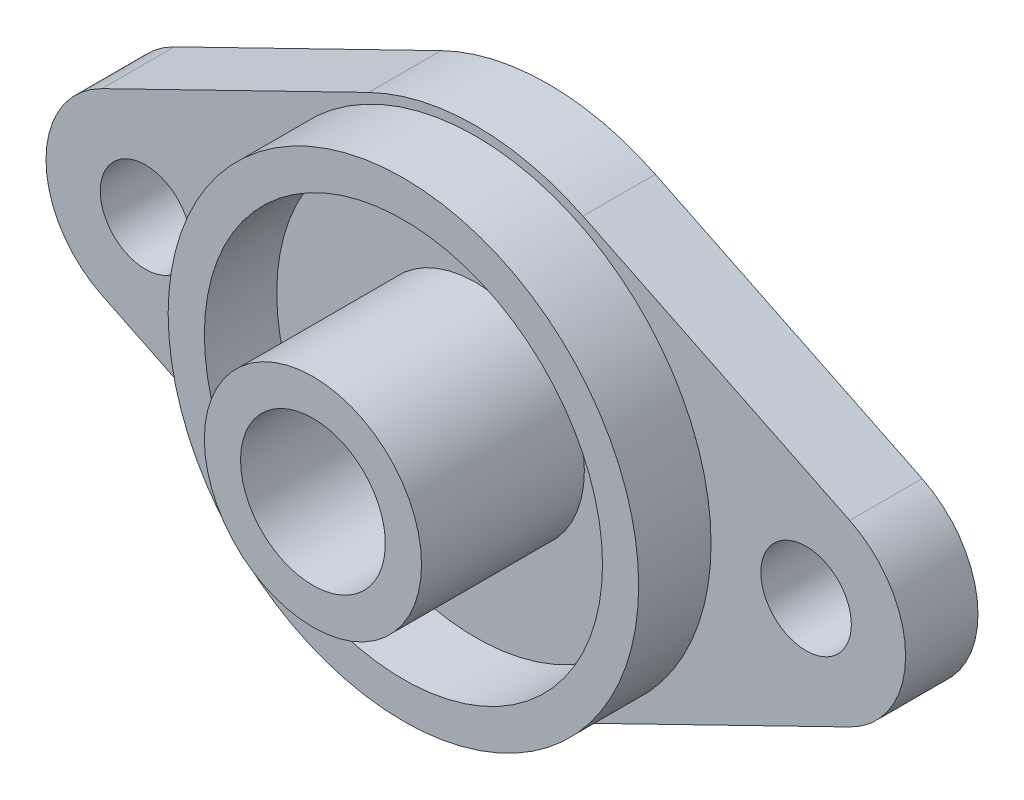
ISO-10303-21;
HEADER;
FILE_DESCRIPTION(('STEP AP214'),'2;1');
FILE_NAME('part.step','',(''),(''),'','','');
FILE_SCHEMA(('AUTOMOTIVE_DESIGN { 1 0 10303 214 1 1 1 1 }'));
ENDSEC;
DATA;
#1=APPLICATION_CONTEXT('core data for automotive mechanical design processes');
#2=APPLICATION_PROTOCOL_DEFINITION('international standard','automotive_design',2000,#1);
#3=PRODUCT_CONTEXT('',#1,'mechanical');
#4=PRODUCT('Part','Part','',(#3));
#5=PRODUCT_RELATED_PRODUCT_CATEGORY('part','',(#4));
#6=PRODUCT_DEFINITION_FORMATION('','',#4);
#7=PRODUCT_DEFINITION_CONTEXT('part definition',#1,'design');
#8=PRODUCT_DEFINITION('design','',#6,#7);
#9=PRODUCT_DEFINITION_SHAPE('','',#8);
#10=(LENGTH_UNIT() NAMED_UNIT(*) SI_UNIT(.MILLI.,.METRE.));
#11=(NAMED_UNIT(*) PLANE_ANGLE_UNIT() SI_UNIT($,.RADIAN.));
#12=(NAMED_UNIT(*) SI_UNIT($,.STERADIAN.) SOLID_ANGLE_UNIT());
#13=UNCERTAINTY_MEASURE_WITH_UNIT(LENGTH_MEASURE(1.E-05),#10,'distance_accuracy_value','');
#14=(GEOMETRIC_REPRESENTATION_CONTEXT(3) GLOBAL_UNCERTAINTY_ASSIGNED_CONTEXT((#13)) GLOBAL_UNIT_ASSIGNED_CONTEXT((#10,
#11,#12)) REPRESENTATION_CONTEXT('',''));
#15=CARTESIAN_POINT('',(0.,0.,0.));
#16=DIRECTION('',(0.,0.,1.));
#17=DIRECTION('',(1.,0.,0.));
#18=AXIS2_PLACEMENT_3D('',#15,#16,#17);
#19=CARTESIAN_POINT('',(-18.25,0.,4.));
#20=DIRECTION('',(0.,0.,1.));
#21=DIRECTION('',(1.,0.,0.));
#22=AXIS2_PLACEMENT_3D('',#19,#20,#21);
#23=PLANE('',#22);
#24=CARTESIAN_POINT('',(0.,0.,4.));
#25=DIRECTION('',(0.,0.,-1.));
#26=DIRECTION('',(-1.,0.,0.));
#27=AXIS2_PLACEMENT_3D('',#24,#25,#26);
#28=CIRCLE('',#27,6.);
#29=CARTESIAN_POINT('',(-6.,0.,4.));
#30=VERTEX_POINT('',#29);
#31=EDGE_CURVE('E155',#30,#30,#28,.T.);
#32=ORIENTED_EDGE('',*,*,#31,.T.);
#33=EDGE_LOOP('',(#32));
#34=FACE_BOUND('',#33,.T.);
#35=CARTESIAN_POINT('',(0.,0.,4.));
#36=DIRECTION('',(0.,0.,-1.));
#37=DIRECTION('',(-1.,0.,0.));
#38=AXIS2_PLACEMENT_3D('',#35,#36,#37);
#39=CIRCLE('',#38,11.);
#40=CARTESIAN_POINT('',(-11.,0.,4.));
#41=VERTEX_POINT('',#40);
#42=EDGE_CURVE('E220',#41,#41,#39,.T.);
#43=ORIENTED_EDGE('',*,*,#42,.F.);
#44=EDGE_LOOP('',(#43));
#45=FACE_BOUND('',#44,.T.);
#46=ADVANCED_FACE('F45',(#34,#45),#23,.T.);
#47=CARTESIAN_POINT('',(0.,0.,-13.4337548790008));
#48=DIRECTION('',(0.,0.,-1.));
#49=DIRECTION('',(-1.,0.,0.));
#50=AXIS2_PLACEMENT_3D('',#47,#48,#49);
#51=CYLINDRICAL_SURFACE('',#50,4.);
#52=CARTESIAN_POINT('',(0.,0.,13.));
#53=DIRECTION('',(0.,0.,-1.));
#54=DIRECTION('',(-1.,0.,0.));
#55=AXIS2_PLACEMENT_3D('',#52,#53,#54);
#56=CIRCLE('',#55,4.);
#57=CARTESIAN_POINT('',(-4.,0.,13.));
#58=VERTEX_POINT('',#57);
#59=EDGE_CURVE('E232',#58,#58,#56,.T.);
#60=ORIENTED_EDGE('',*,*,#59,.F.);
#61=EDGE_LOOP('',(#60));
#62=FACE_BOUND('',#61,.T.);
#63=CARTESIAN_POINT('',(0.,0.,0.));
#64=DIRECTION('',(0.,0.,1.));
#65=DIRECTION('',(1.,0.,0.));
#66=AXIS2_PLACEMENT_3D('',#63,#64,#65);
#67=CIRCLE('',#66,3.99999999999999);
#68=CARTESIAN_POINT('',(3.99999999999999,0.,0.));
#69=VERTEX_POINT('',#68);
#70=EDGE_CURVE('E49',#69,#69,#67,.T.);
#71=ORIENTED_EDGE('',*,*,#70,.F.);
#72=EDGE_LOOP('',(#71));
#73=FACE_BOUND('',#72,.T.);
#74=ADVANCED_FACE('F272',(#62,#73),#51,.F.);
#75=CARTESIAN_POINT('',(0.,0.,-13.4337548790008));
#76=DIRECTION('',(0.,0.,-1.));
#77=DIRECTION('',(-1.,0.,0.));
#78=AXIS2_PLACEMENT_3D('',#75,#76,#77);
#79=CYLINDRICAL_SURFACE('',#78,6.);
#80=ORIENTED_EDGE('',*,*,#31,.F.);
#81=EDGE_LOOP('',(#80));
#82=FACE_BOUND('',#81,.T.);
#83=CARTESIAN_POINT('',(0.,0.,13.));
#84=DIRECTION('',(0.,0.,-1.));
#85=DIRECTION('',(-1.,0.,0.));
#86=AXIS2_PLACEMENT_3D('',#83,#84,#85);
#87=CIRCLE('',#86,6.);
#88=CARTESIAN_POINT('',(-6.,0.,13.));
#89=VERTEX_POINT('',#88);
#90=EDGE_CURVE('E236',#89,#89,#87,.T.);
#91=ORIENTED_EDGE('',*,*,#90,.T.);
#92=EDGE_LOOP('',(#91));
#93=FACE_BOUND('',#92,.T.);
#94=ADVANCED_FACE('F278',(#82,#93),#79,.T.);
#95=CARTESIAN_POINT('',(4.,0.,13.));
#96=DIRECTION('',(0.,0.,-1.));
#97=DIRECTION('',(-1.,0.,0.));
#98=AXIS2_PLACEMENT_3D('',#95,#96,#97);
#99=PLANE('',#98);
#100=ORIENTED_EDGE('',*,*,#90,.F.);
#101=EDGE_LOOP('',(#100));
#102=FACE_BOUND('',#101,.T.);
#103=ORIENTED_EDGE('',*,*,#59,.T.);
#104=EDGE_LOOP('',(#103));
#105=FACE_BOUND('',#104,.T.);
#106=ADVANCED_FACE('F407',(#102,#105),#99,.F.);
#107=CARTESIAN_POINT('',(0.,0.,-13.4337548790008));
#108=DIRECTION('',(0.,0.,-1.));
#109=DIRECTION('',(-1.,0.,0.));
#110=AXIS2_PLACEMENT_3D('',#107,#108,#109);
#111=CYLINDRICAL_SURFACE('',#110,13.);
#112=CARTESIAN_POINT('',(0.,0.,4.));
#113=DIRECTION('',(0.,0.,-1.));
#114=DIRECTION('',(-1.,0.,0.));
#115=AXIS2_PLACEMENT_3D('',#112,#113,#114);
#116=CIRCLE('',#115,13.);
#117=CARTESIAN_POINT('',(-13.,0.,4.));
#118=VERTEX_POINT('',#117);
#119=EDGE_CURVE('E216',#118,#118,#116,.T.);
#120=ORIENTED_EDGE('',*,*,#119,.F.);
#121=EDGE_LOOP('',(#120));
#122=FACE_BOUND('',#121,.T.);
#123=CARTESIAN_POINT('',(0.,0.,8.));
#124=DIRECTION('',(0.,0.,-1.));
#125=DIRECTION('',(-1.,0.,0.));
#126=AXIS2_PLACEMENT_3D('',#123,#124,#125);
#127=CIRCLE('',#126,13.);
#128=CARTESIAN_POINT('',(-13.,0.,8.));
#129=VERTEX_POINT('',#128);
#130=EDGE_CURVE('E228',#129,#129,#127,.T.);
#131=ORIENTED_EDGE('',*,*,#130,.T.);
#132=EDGE_LOOP('',(#131));
#133=FACE_BOUND('',#132,.T.);
#134=ADVANCED_FACE('F417',(#122,#133),#111,.T.);
#135=CARTESIAN_POINT('',(13.,0.,8.));
#136=DIRECTION('',(0.,0.,-1.));
#137=DIRECTION('',(-1.,0.,0.));
#138=AXIS2_PLACEMENT_3D('',#135,#136,#137);
#139=PLANE('',#138);
#140=ORIENTED_EDGE('',*,*,#130,.F.);
#141=EDGE_LOOP('',(#140));
#142=FACE_BOUND('',#141,.T.);
#143=CARTESIAN_POINT('',(0.,0.,8.));
#144=DIRECTION('',(0.,0.,-1.));
#145=DIRECTION('',(-1.,0.,0.));
#146=AXIS2_PLACEMENT_3D('',#143,#144,#145);
#147=CIRCLE('',#146,11.);
#148=CARTESIAN_POINT('',(-11.,0.,8.));
#149=VERTEX_POINT('',#148);
#150=EDGE_CURVE('E224',#149,#149,#147,.T.);
#151=ORIENTED_EDGE('',*,*,#150,.T.);
#152=EDGE_LOOP('',(#151));
#153=FACE_BOUND('',#152,.T.);
#154=ADVANCED_FACE('F427',(#142,#153),#139,.F.);
#155=CARTESIAN_POINT('',(0.,0.,-13.4337548790008));
#156=DIRECTION('',(0.,0.,-1.));
#157=DIRECTION('',(-1.,0.,0.));
#158=AXIS2_PLACEMENT_3D('',#155,#156,#157);
#159=CYLINDRICAL_SURFACE('',#158,11.);
#160=ORIENTED_EDGE('',*,*,#150,.F.);
#161=EDGE_LOOP('',(#160));
#162=FACE_BOUND('',#161,.T.);
#163=ORIENTED_EDGE('',*,*,#42,.T.);
#164=EDGE_LOOP('',(#163));
#165=FACE_BOUND('',#164,.T.);
#166=ADVANCED_FACE('F268',(#162,#165),#159,.F.);
#167=CARTESIAN_POINT('',(-18.25,0.,0.));
#168=DIRECTION('',(0.,0.,1.));
#169=DIRECTION('',(1.,0.,0.));
#170=AXIS2_PLACEMENT_3D('',#167,#168,#169);
#171=PLANE('',#170);
#172=ORIENTED_EDGE('',*,*,#70,.T.);
#173=EDGE_LOOP('',(#172));
#174=FACE_BOUND('',#173,.T.);
#175=CARTESIAN_POINT('',(-18.25,0.,0.));
#176=DIRECTION('',(0.,0.,-1.));
#177=DIRECTION('',(-1.,0.,0.));
#178=AXIS2_PLACEMENT_3D('',#175,#176,#177);
#179=CIRCLE('',#178,2.5);
#180=CARTESIAN_POINT('',(-20.75,0.,0.));
#181=VERTEX_POINT('',#180);
#182=EDGE_CURVE('E198',#181,#181,#179,.T.);
#183=ORIENTED_EDGE('',*,*,#182,.F.);
#184=EDGE_LOOP('',(#183));
#185=FACE_BOUND('',#184,.T.);
#186=CARTESIAN_POINT('',(18.25,0.,0.));
#187=DIRECTION('',(0.,0.,-1.));
#188=DIRECTION('',(-1.,0.,0.));
#189=AXIS2_PLACEMENT_3D('',#186,#187,#188);
#190=CIRCLE('',#189,2.5);
#191=CARTESIAN_POINT('',(15.75,0.,0.));
#192=VERTEX_POINT('',#191);
#193=EDGE_CURVE('E197',#192,#192,#190,.T.);
#194=ORIENTED_EDGE('',*,*,#193,.F.);
#195=EDGE_LOOP('',(#194));
#196=FACE_BOUND('',#195,.T.);
#197=CARTESIAN_POINT('',(-18.25,0.,0.));
#198=DIRECTION('',(0.,0.,1.));
#199=DIRECTION('',(1.,0.,0.));
#200=AXIS2_PLACEMENT_3D('',#197,#198,#199);
#201=CIRCLE('',#200,5.5);
#202=CARTESIAN_POINT('',(-20.6609589041096,4.94340744453607,0.));
#203=VERTEX_POINT('',#202);
#204=CARTESIAN_POINT('',(-20.6609589041096,-4.94340744453607,0.));
#205=VERTEX_POINT('',#204);
#206=EDGE_CURVE('E151',#203,#205,#201,.T.);
#207=ORIENTED_EDGE('',*,*,#206,.F.);
#208=DIRECTION('',(0.898801353552014,0.438356164383562,0.));
#209=VECTOR('',#208,1.);
#210=CARTESIAN_POINT('',(-20.6609589041096,4.94340744453607,0.));
#211=LINE('',#210,#209);
#212=CARTESIAN_POINT('',(-5.91780821917808,12.1338182729522,0.));
#213=VERTEX_POINT('',#212);
#214=EDGE_CURVE('E175',#203,#213,#211,.T.);
#215=ORIENTED_EDGE('',*,*,#214,.T.);
#216=CARTESIAN_POINT('',(0.,0.,0.));
#217=DIRECTION('',(0.,0.,1.));
#218=DIRECTION('',(1.,0.,0.));
#219=AXIS2_PLACEMENT_3D('',#216,#217,#218);
#220=CIRCLE('',#219,13.5);
#221=CARTESIAN_POINT('',(5.91780821917809,12.1338182729522,0.));
#222=VERTEX_POINT('',#221);
#223=EDGE_CURVE('E172',#222,#213,#220,.T.);
#224=ORIENTED_EDGE('',*,*,#223,.F.);
#225=DIRECTION('',(-0.898801353552014,0.438356164383562,0.));
#226=VECTOR('',#225,1.);
#227=CARTESIAN_POINT('',(20.6609589041096,4.94340744453607,0.));
#228=LINE('',#227,#226);
#229=CARTESIAN_POINT('',(20.6609589041096,4.94340744453607,0.));
#230=VERTEX_POINT('',#229);
#231=EDGE_CURVE('E137',#230,#222,#228,.T.);
#232=ORIENTED_EDGE('',*,*,#231,.F.);
#233=CARTESIAN_POINT('',(18.25,0.,0.));
#234=DIRECTION('',(0.,0.,-1.));
#235=DIRECTION('',(-1.,0.,0.));
#236=AXIS2_PLACEMENT_3D('',#233,#234,#235);
#237=CIRCLE('',#236,5.5);
#238=CARTESIAN_POINT('',(20.6609589041096,-4.94340744453607,0.));
#239=VERTEX_POINT('',#238);
#240=EDGE_CURVE('E166',#230,#239,#237,.T.);
#241=ORIENTED_EDGE('',*,*,#240,.T.);
#242=DIRECTION('',(-0.898801353552013,-0.438356164383562,0.));
#243=VECTOR('',#242,1.);
#244=CARTESIAN_POINT('',(20.6609589041096,-4.94340744453607,0.));
#245=LINE('',#244,#243);
#246=CARTESIAN_POINT('',(5.91780821917809,-12.1338182729522,0.));
#247=VERTEX_POINT('',#246);
#248=EDGE_CURVE('E162',#239,#247,#245,.T.);
#249=ORIENTED_EDGE('',*,*,#248,.T.);
#250=CARTESIAN_POINT('',(0.,0.,0.));
#251=DIRECTION('',(0.,0.,1.));
#252=DIRECTION('',(1.,0.,0.));
#253=AXIS2_PLACEMENT_3D('',#250,#251,#252);
#254=CIRCLE('',#253,13.5);
#255=CARTESIAN_POINT('',(-5.91780821917809,-12.1338182729522,0.));
#256=VERTEX_POINT('',#255);
#257=EDGE_CURVE('E158',#256,#247,#254,.T.);
#258=ORIENTED_EDGE('',*,*,#257,.F.);
#259=DIRECTION('',(0.898801353552013,-0.438356164383562,0.));
#260=VECTOR('',#259,1.);
#261=CARTESIAN_POINT('',(-20.6609589041096,-4.94340744453607,0.));
#262=LINE('',#261,#260);
#263=EDGE_CURVE('E154',#205,#256,#262,.T.);
#264=ORIENTED_EDGE('',*,*,#263,.F.);
#265=EDGE_LOOP('',(#207,#215,#224,#232,#241,#249,#258,#264));
#266=FACE_BOUND('',#265,.T.);
#267=ADVANCED_FACE('F259',(#174,#185,#196,#266),#171,.F.);
#268=CARTESIAN_POINT('',(-20.6609589041096,4.94340744453607,4.));
#269=DIRECTION('',(-0.438356164383562,0.898801353552014,0.));
#270=DIRECTION('',(-0.898801353552014,-0.438356164383562,0.));
#271=AXIS2_PLACEMENT_3D('',#268,#269,#270);
#272=PLANE('',#271);
#273=ORIENTED_EDGE('',*,*,#214,.F.);
#274=DIRECTION('',(0.,0.,-1.));
#275=VECTOR('',#274,1.);
#276=CARTESIAN_POINT('',(-20.6609589041096,4.94340744453607,4.));
#277=LINE('',#276,#275);
#278=CARTESIAN_POINT('',(-20.6609589041096,4.94340744453607,4.));
#279=VERTEX_POINT('',#278);
#280=EDGE_CURVE('E65',#279,#203,#277,.T.);
#281=ORIENTED_EDGE('',*,*,#280,.F.);
#282=DIRECTION('',(0.898801353552014,0.438356164383562,0.));
#283=VECTOR('',#282,1.);
#284=CARTESIAN_POINT('',(-20.6609589041096,4.94340744453607,4.));
#285=LINE('',#284,#283);
#286=CARTESIAN_POINT('',(-5.91780821917808,12.1338182729522,4.));
#287=VERTEX_POINT('',#286);
#288=EDGE_CURVE('E145',#279,#287,#285,.T.);
#289=ORIENTED_EDGE('',*,*,#288,.T.);
#290=DIRECTION('',(0.,0.,-1.));
#291=VECTOR('',#290,1.);
#292=CARTESIAN_POINT('',(-5.91780821917808,12.1338182729522,4.));
#293=LINE('',#292,#291);
#294=EDGE_CURVE('E92',#287,#213,#293,.T.);
#295=ORIENTED_EDGE('',*,*,#294,.T.);
#296=EDGE_LOOP('',(#273,#281,#289,#295));
#297=FACE_BOUND('',#296,.T.);
#298=ADVANCED_FACE('F260',(#297),#272,.T.);
#299=CARTESIAN_POINT('',(0.,0.,4.));
#300=DIRECTION('',(0.,0.,-1.));
#301=DIRECTION('',(-1.,0.,0.));
#302=AXIS2_PLACEMENT_3D('',#299,#300,#301);
#303=CYLINDRICAL_SURFACE('',#302,13.5);
#304=ORIENTED_EDGE('',*,*,#223,.T.);
#305=ORIENTED_EDGE('',*,*,#294,.F.);
#306=CARTESIAN_POINT('',(0.,0.,4.));
#307=DIRECTION('',(0.,0.,1.));
#308=DIRECTION('',(1.,0.,0.));
#309=AXIS2_PLACEMENT_3D('',#306,#307,#308);
#310=CIRCLE('',#309,13.5);
#311=CARTESIAN_POINT('',(5.91780821917809,12.1338182729522,4.));
#312=VERTEX_POINT('',#311);
#313=EDGE_CURVE('E126',#312,#287,#310,.T.);
#314=ORIENTED_EDGE('',*,*,#313,.F.);
#315=DIRECTION('',(0.,0.,-1.));
#316=VECTOR('',#315,1.);
#317=CARTESIAN_POINT('',(5.91780821917809,12.1338182729522,4.));
#318=LINE('',#317,#316);
#319=EDGE_CURVE('E134',#312,#222,#318,.T.);
#320=ORIENTED_EDGE('',*,*,#319,.T.);
#321=EDGE_LOOP('',(#304,#305,#314,#320));
#322=FACE_BOUND('',#321,.T.);
#323=ADVANCED_FACE('F143',(#322),#303,.T.);
#324=CARTESIAN_POINT('',(20.6609589041096,4.94340744453607,4.));
#325=DIRECTION('',(-0.438356164383562,-0.898801353552014,0.));
#326=DIRECTION('',(0.898801353552014,-0.438356164383562,0.));
#327=AXIS2_PLACEMENT_3D('',#324,#325,#326);
#328=PLANE('',#327);
#329=ORIENTED_EDGE('',*,*,#231,.T.);
#330=ORIENTED_EDGE('',*,*,#319,.F.);
#331=DIRECTION('',(-0.898801353552014,0.438356164383562,0.));
#332=VECTOR('',#331,1.);
#333=CARTESIAN_POINT('',(20.6609589041096,4.94340744453607,4.));
#334=LINE('',#333,#332);
#335=CARTESIAN_POINT('',(20.6609589041096,4.94340744453607,4.));
#336=VERTEX_POINT('',#335);
#337=EDGE_CURVE('E120',#336,#312,#334,.T.);
#338=ORIENTED_EDGE('',*,*,#337,.F.);
#339=DIRECTION('',(0.,0.,-1.));
#340=VECTOR('',#339,1.);
#341=CARTESIAN_POINT('',(20.6609589041096,4.94340744453607,4.));
#342=LINE('',#341,#340);
#343=EDGE_CURVE('E141',#336,#230,#342,.T.);
#344=ORIENTED_EDGE('',*,*,#343,.T.);
#345=EDGE_LOOP('',(#329,#330,#338,#344));
#346=FACE_BOUND('',#345,.T.);
#347=ADVANCED_FACE('F135',(#346),#328,.F.);
#348=CARTESIAN_POINT('',(18.25,0.,4.));
#349=DIRECTION('',(0.,0.,-1.));
#350=DIRECTION('',(-1.,0.,0.));
#351=AXIS2_PLACEMENT_3D('',#348,#349,#350);
#352=CYLINDRICAL_SURFACE('',#351,5.5);
#353=ORIENTED_EDGE('',*,*,#240,.F.);
#354=ORIENTED_EDGE('',*,*,#343,.F.);
#355=CARTESIAN_POINT('',(18.25,0.,4.));
#356=DIRECTION('',(0.,0.,-1.));
#357=DIRECTION('',(-1.,0.,0.));
#358=AXIS2_PLACEMENT_3D('',#355,#356,#357);
#359=CIRCLE('',#358,5.5);
#360=CARTESIAN_POINT('',(20.6609589041096,-4.94340744453607,4.));
#361=VERTEX_POINT('',#360);
#362=EDGE_CURVE('E129',#336,#361,#359,.T.);
#363=ORIENTED_EDGE('',*,*,#362,.T.);
#364=DIRECTION('',(0.,0.,-1.));
#365=VECTOR('',#364,1.);
#366=CARTESIAN_POINT('',(20.6609589041096,-4.94340744453607,4.));
#367=LINE('',#366,#365);
#368=EDGE_CURVE('E186',#361,#239,#367,.T.);
#369=ORIENTED_EDGE('',*,*,#368,.T.);
#370=EDGE_LOOP('',(#353,#354,#363,#369));
#371=FACE_BOUND('',#370,.T.);
#372=ADVANCED_FACE('F256',(#371),#352,.T.);
#373=CARTESIAN_POINT('',(20.6609589041096,-4.94340744453607,4.));
#374=DIRECTION('',(0.438356164383562,-0.898801353552014,0.));
#375=DIRECTION('',(0.898801353552014,0.438356164383562,0.));
#376=AXIS2_PLACEMENT_3D('',#373,#374,#375);
#377=PLANE('',#376);
#378=ORIENTED_EDGE('',*,*,#248,.F.);
#379=ORIENTED_EDGE('',*,*,#368,.F.);
#380=DIRECTION('',(-0.898801353552013,-0.438356164383562,0.));
#381=VECTOR('',#380,1.);
#382=CARTESIAN_POINT('',(20.6609589041096,-4.94340744453607,4.));
#383=LINE('',#382,#381);
#384=CARTESIAN_POINT('',(5.91780821917809,-12.1338182729522,4.));
#385=VERTEX_POINT('',#384);
#386=EDGE_CURVE('E250',#361,#385,#383,.T.);
#387=ORIENTED_EDGE('',*,*,#386,.T.);
#388=DIRECTION('',(0.,0.,-1.));
#389=VECTOR('',#388,1.);
#390=CARTESIAN_POINT('',(5.91780821917809,-12.1338182729522,4.));
#391=LINE('',#390,#389);
#392=EDGE_CURVE('E189',#385,#247,#391,.T.);
#393=ORIENTED_EDGE('',*,*,#392,.T.);
#394=EDGE_LOOP('',(#378,#379,#387,#393));
#395=FACE_BOUND('',#394,.T.);
#396=ADVANCED_FACE('F308',(#395),#377,.T.);
#397=CARTESIAN_POINT('',(0.,0.,4.));
#398=DIRECTION('',(0.,0.,-1.));
#399=DIRECTION('',(-1.,0.,0.));
#400=AXIS2_PLACEMENT_3D('',#397,#398,#399);
#401=CYLINDRICAL_SURFACE('',#400,13.5);
#402=ORIENTED_EDGE('',*,*,#257,.T.);
#403=ORIENTED_EDGE('',*,*,#392,.F.);
#404=CARTESIAN_POINT('',(0.,0.,4.));
#405=DIRECTION('',(0.,0.,1.));
#406=DIRECTION('',(1.,0.,0.));
#407=AXIS2_PLACEMENT_3D('',#404,#405,#406);
#408=CIRCLE('',#407,13.5);
#409=CARTESIAN_POINT('',(-5.91780821917809,-12.1338182729522,4.));
#410=VERTEX_POINT('',#409);
#411=EDGE_CURVE('E247',#410,#385,#408,.T.);
#412=ORIENTED_EDGE('',*,*,#411,.F.);
#413=DIRECTION('',(0.,0.,-1.));
#414=VECTOR('',#413,1.);
#415=CARTESIAN_POINT('',(-5.91780821917809,-12.1338182729522,4.));
#416=LINE('',#415,#414);
#417=EDGE_CURVE('E56',#410,#256,#416,.T.);
#418=ORIENTED_EDGE('',*,*,#417,.T.);
#419=EDGE_LOOP('',(#402,#403,#412,#418));
#420=FACE_BOUND('',#419,.T.);
#421=ADVANCED_FACE('F301',(#420),#401,.T.);
#422=CARTESIAN_POINT('',(-20.6609589041096,-4.94340744453607,4.));
#423=DIRECTION('',(0.438356164383562,0.898801353552014,0.));
#424=DIRECTION('',(-0.898801353552014,0.438356164383562,0.));
#425=AXIS2_PLACEMENT_3D('',#422,#423,#424);
#426=PLANE('',#425);
#427=ORIENTED_EDGE('',*,*,#263,.T.);
#428=ORIENTED_EDGE('',*,*,#417,.F.);
#429=DIRECTION('',(0.898801353552013,-0.438356164383562,0.));
#430=VECTOR('',#429,1.);
#431=CARTESIAN_POINT('',(-20.6609589041096,-4.94340744453607,4.));
#432=LINE('',#431,#430);
#433=CARTESIAN_POINT('',(-20.6609589041096,-4.94340744453607,4.));
#434=VERTEX_POINT('',#433);
#435=EDGE_CURVE('E104',#434,#410,#432,.T.);
#436=ORIENTED_EDGE('',*,*,#435,.F.);
#437=DIRECTION('',(0.,0.,-1.));
#438=VECTOR('',#437,1.);
#439=CARTESIAN_POINT('',(-20.6609589041096,-4.94340744453607,4.));
#440=LINE('',#439,#438);
#441=EDGE_CURVE('E11',#434,#205,#440,.T.);
#442=ORIENTED_EDGE('',*,*,#441,.T.);
#443=EDGE_LOOP('',(#427,#428,#436,#442));
#444=FACE_BOUND('',#443,.T.);
#445=ADVANCED_FACE('F292',(#444),#426,.F.);
#446=CARTESIAN_POINT('',(-18.25,0.,4.));
#447=DIRECTION('',(0.,0.,-1.));
#448=DIRECTION('',(-1.,0.,0.));
#449=AXIS2_PLACEMENT_3D('',#446,#447,#448);
#450=CYLINDRICAL_SURFACE('',#449,5.5);
#451=ORIENTED_EDGE('',*,*,#206,.T.);
#452=ORIENTED_EDGE('',*,*,#441,.F.);
#453=CARTESIAN_POINT('',(-18.25,0.,4.));
#454=DIRECTION('',(0.,0.,1.));
#455=DIRECTION('',(1.,0.,0.));
#456=AXIS2_PLACEMENT_3D('',#453,#454,#455);
#457=CIRCLE('',#456,5.5);
#458=EDGE_CURVE('E179',#279,#434,#457,.T.);
#459=ORIENTED_EDGE('',*,*,#458,.F.);
#460=ORIENTED_EDGE('',*,*,#280,.T.);
#461=EDGE_LOOP('',(#451,#452,#459,#460));
#462=FACE_BOUND('',#461,.T.);
#463=ADVANCED_FACE('F47',(#462),#450,.T.);
#464=CARTESIAN_POINT('',(-18.25,0.,4.));
#465=DIRECTION('',(0.,0.,1.));
#466=DIRECTION('',(1.,0.,0.));
#467=AXIS2_PLACEMENT_3D('',#464,#465,#466);
#468=CIRCLE('',#467,2.5);
#469=CARTESIAN_POINT('',(-15.75,0.,4.));
#470=VERTEX_POINT('',#469);
#471=EDGE_CURVE('E194',#470,#470,#468,.T.);
#472=ORIENTED_EDGE('',*,*,#471,.F.);
#473=EDGE_LOOP('',(#472));
#474=FACE_BOUND('',#473,.T.);
#475=CARTESIAN_POINT('',(18.25,0.,4.));
#476=DIRECTION('',(0.,0.,1.));
#477=DIRECTION('',(1.,0.,0.));
#478=AXIS2_PLACEMENT_3D('',#475,#476,#477);
#479=CIRCLE('',#478,2.5);
#480=CARTESIAN_POINT('',(20.75,0.,4.));
#481=VERTEX_POINT('',#480);
#482=EDGE_CURVE('E204',#481,#481,#479,.T.);
#483=ORIENTED_EDGE('',*,*,#482,.F.);
#484=EDGE_LOOP('',(#483));
#485=FACE_BOUND('',#484,.T.);
#486=ORIENTED_EDGE('',*,*,#458,.T.);
#487=ORIENTED_EDGE('',*,*,#435,.T.);
#488=ORIENTED_EDGE('',*,*,#411,.T.);
#489=ORIENTED_EDGE('',*,*,#386,.F.);
#490=ORIENTED_EDGE('',*,*,#362,.F.);
#491=ORIENTED_EDGE('',*,*,#337,.T.);
#492=ORIENTED_EDGE('',*,*,#313,.T.);
#493=ORIENTED_EDGE('',*,*,#288,.F.);
#494=EDGE_LOOP('',(#486,#487,#488,#489,#490,#491,#492,#493));
#495=FACE_BOUND('',#494,.T.);
#496=ORIENTED_EDGE('',*,*,#119,.T.);
#497=EDGE_LOOP('',(#496));
#498=FACE_BOUND('',#497,.T.);
#499=ADVANCED_FACE('F122',(#474,#485,#495,#498),#23,.T.);
#500=CARTESIAN_POINT('',(18.25,0.,0.));
#501=DIRECTION('',(0.,0.,-1.));
#502=DIRECTION('',(-1.,0.,0.));
#503=AXIS2_PLACEMENT_3D('',#500,#501,#502);
#504=CYLINDRICAL_SURFACE('',#503,2.5);
#505=ORIENTED_EDGE('',*,*,#482,.T.);
#506=EDGE_LOOP('',(#505));
#507=FACE_BOUND('',#506,.T.);
#508=ORIENTED_EDGE('',*,*,#193,.T.);
#509=EDGE_LOOP('',(#508));
#510=FACE_BOUND('',#509,.T.);
#511=ADVANCED_FACE('F283',(#507,#510),#504,.F.);
#512=CARTESIAN_POINT('',(-18.25,0.,0.));
#513=DIRECTION('',(0.,0.,-1.));
#514=DIRECTION('',(-1.,0.,0.));
#515=AXIS2_PLACEMENT_3D('',#512,#513,#514);
#516=CYLINDRICAL_SURFACE('',#515,2.5);
#517=ORIENTED_EDGE('',*,*,#471,.T.);
#518=EDGE_LOOP('',(#517));
#519=FACE_BOUND('',#518,.T.);
#520=ORIENTED_EDGE('',*,*,#182,.T.);
#521=EDGE_LOOP('',(#520));
#522=FACE_BOUND('',#521,.T.);
#523=ADVANCED_FACE('F289',(#519,#522),#516,.F.);
#524=CLOSED_SHELL('',(#46,#74,#94,#106,#134,#154,#166,#267,#298,#323,#347,#372,#396,#421,#445,
#463,#499,#511,#523));
#525=MANIFOLD_SOLID_BREP('B2',#524);
#526=ADVANCED_BREP_SHAPE_REPRESENTATION('',(#18,#525),#14);
#527=SHAPE_DEFINITION_REPRESENTATION(#9,#526);
ENDSEC;
END-ISO-10303-21;
